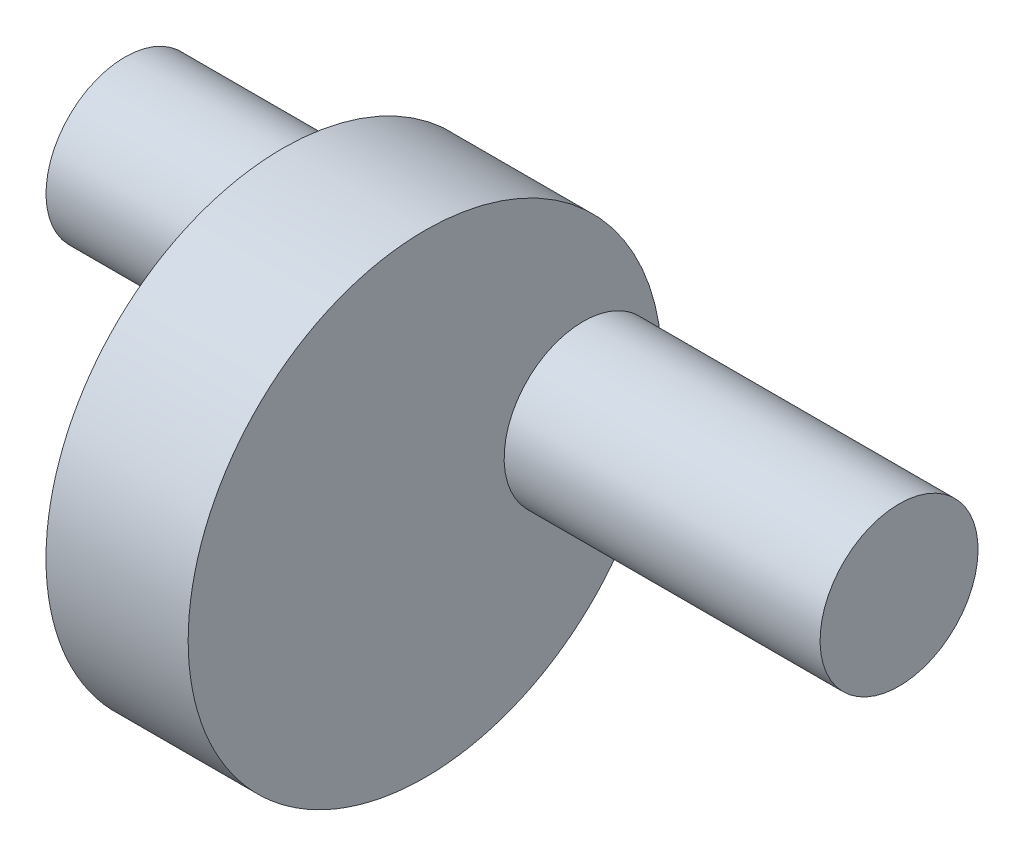
ISO-10303-21;
HEADER;
FILE_DESCRIPTION(('STEP AP214'),'2;1');
FILE_NAME('part.step','',(''),(''),'','','');
FILE_SCHEMA(('AUTOMOTIVE_DESIGN { 1 0 10303 214 1 1 1 1 }'));
ENDSEC;
DATA;
#1=APPLICATION_CONTEXT('core data for automotive mechanical design processes');
#2=APPLICATION_PROTOCOL_DEFINITION('international standard','automotive_design',2000,#1);
#3=PRODUCT_CONTEXT('',#1,'mechanical');
#4=PRODUCT('Part','Part','',(#3));
#5=PRODUCT_RELATED_PRODUCT_CATEGORY('part','',(#4));
#6=PRODUCT_DEFINITION_FORMATION('','',#4);
#7=PRODUCT_DEFINITION_CONTEXT('part definition',#1,'design');
#8=PRODUCT_DEFINITION('design','',#6,#7);
#9=PRODUCT_DEFINITION_SHAPE('','',#8);
#10=(LENGTH_UNIT() NAMED_UNIT(*) SI_UNIT(.MILLI.,.METRE.));
#11=(NAMED_UNIT(*) PLANE_ANGLE_UNIT() SI_UNIT($,.RADIAN.));
#12=(NAMED_UNIT(*) SI_UNIT($,.STERADIAN.) SOLID_ANGLE_UNIT());
#13=UNCERTAINTY_MEASURE_WITH_UNIT(LENGTH_MEASURE(1.E-05),#10,'distance_accuracy_value','');
#14=(GEOMETRIC_REPRESENTATION_CONTEXT(3) GLOBAL_UNCERTAINTY_ASSIGNED_CONTEXT((#13)) GLOBAL_UNIT_ASSIGNED_CONTEXT((#10,
#11,#12)) REPRESENTATION_CONTEXT('',''));
#15=CARTESIAN_POINT('',(0.,0.,0.));
#16=DIRECTION('',(0.,0.,1.));
#17=DIRECTION('',(1.,0.,0.));
#18=AXIS2_PLACEMENT_3D('',#15,#16,#17);
#19=CARTESIAN_POINT('',(-45.,0.,0.));
#20=DIRECTION('',(1.,0.,0.));
#21=DIRECTION('',(0.,1.,0.));
#22=AXIS2_PLACEMENT_3D('',#19,#20,#21);
#23=PLANE('',#22);
#24=CARTESIAN_POINT('',(-45.,0.,0.));
#25=DIRECTION('',(1.,0.,0.));
#26=DIRECTION('',(0.,1.,0.));
#27=AXIS2_PLACEMENT_3D('',#24,#25,#26);
#28=CIRCLE('',#27,50.);
#29=CARTESIAN_POINT('',(-45.,50.,0.));
#30=VERTEX_POINT('',#29);
#31=CARTESIAN_POINT('',(-45.,0.,-50.));
#32=VERTEX_POINT('',#31);
#33=EDGE_CURVE('E11',#30,#32,#28,.T.);
#34=ORIENTED_EDGE('',*,*,#33,.T.);
#35=CARTESIAN_POINT('',(-45.,0.,100.));
#36=DIRECTION('',(1.,0.,0.));
#37=DIRECTION('',(0.,1.,0.));
#38=AXIS2_PLACEMENT_3D('',#35,#36,#37);
#39=CIRCLE('',#38,150.);
#40=CARTESIAN_POINT('',(-45.,150.,100.));
#41=VERTEX_POINT('',#40);
#42=EDGE_CURVE('E34',#41,#32,#39,.T.);
#43=ORIENTED_EDGE('',*,*,#42,.F.);
#44=CARTESIAN_POINT('',(-45.,0.,100.));
#45=DIRECTION('',(1.,0.,0.));
#46=DIRECTION('',(0.,0.,-1.));
#47=AXIS2_PLACEMENT_3D('',#44,#45,#46);
#48=CIRCLE('',#47,150.);
#49=EDGE_CURVE('E69',#32,#41,#48,.T.);
#50=ORIENTED_EDGE('',*,*,#49,.F.);
#51=CARTESIAN_POINT('',(-45.,0.,0.));
#52=DIRECTION('',(1.,0.,0.));
#53=DIRECTION('',(0.,0.,-1.));
#54=AXIS2_PLACEMENT_3D('',#51,#52,#53);
#55=CIRCLE('',#54,50.);
#56=EDGE_CURVE('E24',#32,#30,#55,.T.);
#57=ORIENTED_EDGE('',*,*,#56,.T.);
#58=EDGE_LOOP('',(#34,#43,#50,#57));
#59=FACE_BOUND('',#58,.T.);
#60=ADVANCED_FACE('F17',(#59),#23,.F.);
#61=CARTESIAN_POINT('',(-45.,0.,0.));
#62=DIRECTION('',(1.,0.,0.));
#63=DIRECTION('',(0.,1.,0.));
#64=AXIS2_PLACEMENT_3D('',#61,#62,#63);
#65=CYLINDRICAL_SURFACE('',#64,50.);
#66=ORIENTED_EDGE('',*,*,#56,.F.);
#67=ORIENTED_EDGE('',*,*,#33,.F.);
#68=EDGE_LOOP('',(#66,#67));
#69=FACE_BOUND('',#68,.T.);
#70=CARTESIAN_POINT('',(-245.,0.,0.));
#71=DIRECTION('',(1.,0.,0.));
#72=DIRECTION('',(0.,1.,0.));
#73=AXIS2_PLACEMENT_3D('',#70,#71,#72);
#74=CIRCLE('',#73,50.);
#75=CARTESIAN_POINT('',(-245.,50.,0.));
#76=VERTEX_POINT('',#75);
#77=EDGE_CURVE('E71',#76,#76,#74,.T.);
#78=ORIENTED_EDGE('',*,*,#77,.T.);
#79=EDGE_LOOP('',(#78));
#80=FACE_BOUND('',#79,.T.);
#81=ADVANCED_FACE('F77',(#69,#80),#65,.T.);
#82=CARTESIAN_POINT('',(-45.,0.,100.));
#83=DIRECTION('',(1.,0.,0.));
#84=DIRECTION('',(0.,1.,0.));
#85=AXIS2_PLACEMENT_3D('',#82,#83,#84);
#86=CYLINDRICAL_SURFACE('',#85,150.);
#87=CARTESIAN_POINT('',(45.,0.,100.));
#88=DIRECTION('',(1.,0.,0.));
#89=DIRECTION('',(0.,0.,-1.));
#90=AXIS2_PLACEMENT_3D('',#87,#88,#89);
#91=CIRCLE('',#90,150.);
#92=CARTESIAN_POINT('',(45.,0.,-50.));
#93=VERTEX_POINT('',#92);
#94=CARTESIAN_POINT('',(45.,150.,100.));
#95=VERTEX_POINT('',#94);
#96=EDGE_CURVE('E73',#93,#95,#91,.T.);
#97=ORIENTED_EDGE('',*,*,#96,.F.);
#98=CARTESIAN_POINT('',(45.,0.,100.));
#99=DIRECTION('',(1.,0.,0.));
#100=DIRECTION('',(0.,1.,0.));
#101=AXIS2_PLACEMENT_3D('',#98,#99,#100);
#102=CIRCLE('',#101,150.);
#103=EDGE_CURVE('E62',#95,#93,#102,.T.);
#104=ORIENTED_EDGE('',*,*,#103,.F.);
#105=EDGE_LOOP('',(#97,#104));
#106=FACE_BOUND('',#105,.T.);
#107=ORIENTED_EDGE('',*,*,#42,.T.);
#108=ORIENTED_EDGE('',*,*,#49,.T.);
#109=EDGE_LOOP('',(#107,#108));
#110=FACE_BOUND('',#109,.T.);
#111=ADVANCED_FACE('F80',(#106,#110),#86,.T.);
#112=CARTESIAN_POINT('',(-245.,0.,0.));
#113=DIRECTION('',(1.,0.,0.));
#114=DIRECTION('',(0.,1.,0.));
#115=AXIS2_PLACEMENT_3D('',#112,#113,#114);
#116=PLANE('',#115);
#117=ORIENTED_EDGE('',*,*,#77,.F.);
#118=EDGE_LOOP('',(#117));
#119=FACE_BOUND('',#118,.T.);
#120=ADVANCED_FACE('F83',(#119),#116,.F.);
#121=CARTESIAN_POINT('',(45.,0.,0.));
#122=DIRECTION('',(1.,0.,0.));
#123=DIRECTION('',(0.,1.,0.));
#124=AXIS2_PLACEMENT_3D('',#121,#122,#123);
#125=PLANE('',#124);
#126=CARTESIAN_POINT('',(45.,0.,0.));
#127=DIRECTION('',(1.,0.,0.));
#128=DIRECTION('',(0.,1.,0.));
#129=AXIS2_PLACEMENT_3D('',#126,#127,#128);
#130=CIRCLE('',#129,50.);
#131=CARTESIAN_POINT('',(45.,50.,0.));
#132=VERTEX_POINT('',#131);
#133=EDGE_CURVE('E58',#132,#93,#130,.T.);
#134=ORIENTED_EDGE('',*,*,#133,.F.);
#135=CARTESIAN_POINT('',(45.,0.,0.));
#136=DIRECTION('',(1.,0.,0.));
#137=DIRECTION('',(0.,0.,-1.));
#138=AXIS2_PLACEMENT_3D('',#135,#136,#137);
#139=CIRCLE('',#138,50.);
#140=EDGE_CURVE('E59',#93,#132,#139,.T.);
#141=ORIENTED_EDGE('',*,*,#140,.F.);
#142=ORIENTED_EDGE('',*,*,#96,.T.);
#143=ORIENTED_EDGE('',*,*,#103,.T.);
#144=EDGE_LOOP('',(#134,#141,#142,#143));
#145=FACE_BOUND('',#144,.T.);
#146=ADVANCED_FACE('F85',(#145),#125,.T.);
#147=CARTESIAN_POINT('',(45.,0.,0.));
#148=DIRECTION('',(1.,0.,0.));
#149=DIRECTION('',(0.,1.,0.));
#150=AXIS2_PLACEMENT_3D('',#147,#148,#149);
#151=CYLINDRICAL_SURFACE('',#150,50.);
#152=CARTESIAN_POINT('',(245.,0.,0.));
#153=DIRECTION('',(1.,0.,0.));
#154=DIRECTION('',(0.,1.,0.));
#155=AXIS2_PLACEMENT_3D('',#152,#153,#154);
#156=CIRCLE('',#155,50.);
#157=CARTESIAN_POINT('',(245.,50.,0.));
#158=VERTEX_POINT('',#157);
#159=EDGE_CURVE('E54',#158,#158,#156,.T.);
#160=ORIENTED_EDGE('',*,*,#159,.F.);
#161=EDGE_LOOP('',(#160));
#162=FACE_BOUND('',#161,.T.);
#163=ORIENTED_EDGE('',*,*,#133,.T.);
#164=ORIENTED_EDGE('',*,*,#140,.T.);
#165=EDGE_LOOP('',(#163,#164));
#166=FACE_BOUND('',#165,.T.);
#167=ADVANCED_FACE('F55',(#162,#166),#151,.T.);
#168=CARTESIAN_POINT('',(245.,0.,0.));
#169=DIRECTION('',(1.,0.,0.));
#170=DIRECTION('',(0.,1.,0.));
#171=AXIS2_PLACEMENT_3D('',#168,#169,#170);
#172=PLANE('',#171);
#173=ORIENTED_EDGE('',*,*,#159,.T.);
#174=EDGE_LOOP('',(#173));
#175=FACE_BOUND('',#174,.T.);
#176=ADVANCED_FACE('F138',(#175),#172,.T.);
#177=CLOSED_SHELL('',(#60,#81,#111,#120,#146,#167,#176));
#178=MANIFOLD_SOLID_BREP('B1',#177);
#179=ADVANCED_BREP_SHAPE_REPRESENTATION('',(#18,#178),#14);
#180=SHAPE_DEFINITION_REPRESENTATION(#9,#179);
ENDSEC;
END-ISO-10303-21;
